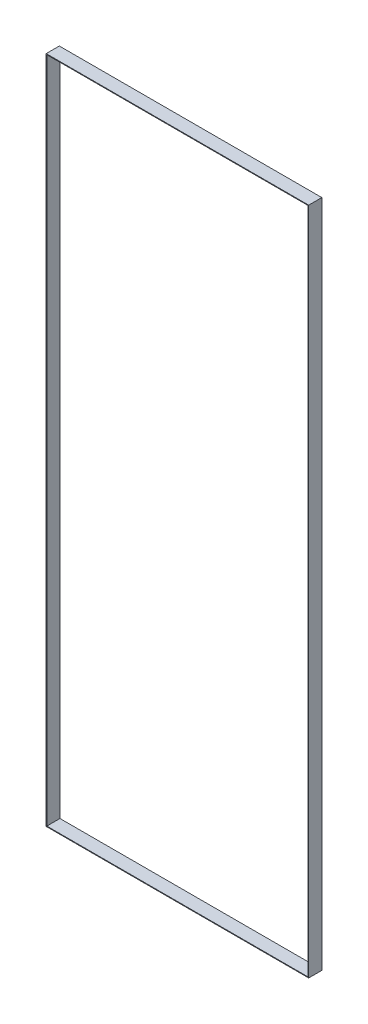
ISO-10303-21;
HEADER;
FILE_DESCRIPTION(('STEP AP214'),'2;1');
FILE_NAME('part.step','',(''),(''),'','','');
FILE_SCHEMA(('AUTOMOTIVE_DESIGN { 1 0 10303 214 1 1 1 1 }'));
ENDSEC;
DATA;
#1=APPLICATION_CONTEXT('core data for automotive mechanical design processes');
#2=APPLICATION_PROTOCOL_DEFINITION('international standard','automotive_design',2000,#1);
#3=PRODUCT_CONTEXT('',#1,'mechanical');
#4=PRODUCT('Part','Part','',(#3));
#5=PRODUCT_RELATED_PRODUCT_CATEGORY('part','',(#4));
#6=PRODUCT_DEFINITION_FORMATION('','',#4);
#7=PRODUCT_DEFINITION_CONTEXT('part definition',#1,'design');
#8=PRODUCT_DEFINITION('design','',#6,#7);
#9=PRODUCT_DEFINITION_SHAPE('','',#8);
#10=(LENGTH_UNIT() NAMED_UNIT(*) SI_UNIT(.MILLI.,.METRE.));
#11=(NAMED_UNIT(*) PLANE_ANGLE_UNIT() SI_UNIT($,.RADIAN.));
#12=(NAMED_UNIT(*) SI_UNIT($,.STERADIAN.) SOLID_ANGLE_UNIT());
#13=UNCERTAINTY_MEASURE_WITH_UNIT(LENGTH_MEASURE(1.E-05),#10,'distance_accuracy_value','');
#14=(GEOMETRIC_REPRESENTATION_CONTEXT(3) GLOBAL_UNCERTAINTY_ASSIGNED_CONTEXT((#13)) GLOBAL_UNIT_ASSIGNED_CONTEXT((#10,
#11,#12)) REPRESENTATION_CONTEXT('',''));
#15=CARTESIAN_POINT('',(0.,0.,0.));
#16=DIRECTION('',(0.,0.,1.));
#17=DIRECTION('',(1.,0.,0.));
#18=AXIS2_PLACEMENT_3D('',#15,#16,#17);
#19=CARTESIAN_POINT('',(-200.,-510.,20.));
#20=DIRECTION('',(1.,0.,0.));
#21=DIRECTION('',(0.,0.,-1.));
#22=AXIS2_PLACEMENT_3D('',#19,#20,#21);
#23=PLANE('',#22);
#24=DIRECTION('',(0.,-1.,0.));
#25=VECTOR('',#24,1.);
#26=CARTESIAN_POINT('',(-200.,-510.,0.));
#27=LINE('',#26,#25);
#28=CARTESIAN_POINT('',(-200.,510.,0.));
#29=VERTEX_POINT('',#28);
#30=CARTESIAN_POINT('',(-200.,-510.,0.));
#31=VERTEX_POINT('',#30);
#32=EDGE_CURVE('E130',#29,#31,#27,.T.);
#33=ORIENTED_EDGE('',*,*,#32,.T.);
#34=DIRECTION('',(0.,0.,-1.));
#35=VECTOR('',#34,1.);
#36=CARTESIAN_POINT('',(-200.,-510.,20.));
#37=LINE('',#36,#35);
#38=CARTESIAN_POINT('',(-200.,-510.,20.));
#39=VERTEX_POINT('',#38);
#40=EDGE_CURVE('E11',#39,#31,#37,.T.);
#41=ORIENTED_EDGE('',*,*,#40,.F.);
#42=DIRECTION('',(0.,-1.,0.));
#43=VECTOR('',#42,1.);
#44=CARTESIAN_POINT('',(-200.,-510.,20.));
#45=LINE('',#44,#43);
#46=CARTESIAN_POINT('',(-200.,510.,20.));
#47=VERTEX_POINT('',#46);
#48=EDGE_CURVE('E134',#47,#39,#45,.T.);
#49=ORIENTED_EDGE('',*,*,#48,.F.);
#50=DIRECTION('',(0.,0.,-1.));
#51=VECTOR('',#50,1.);
#52=CARTESIAN_POINT('',(-200.,510.,20.));
#53=LINE('',#52,#51);
#54=EDGE_CURVE('E144',#47,#29,#53,.T.);
#55=ORIENTED_EDGE('',*,*,#54,.T.);
#56=EDGE_LOOP('',(#33,#41,#49,#55));
#57=FACE_BOUND('',#56,.T.);
#58=ADVANCED_FACE('F33',(#57),#23,.F.);
#59=CARTESIAN_POINT('',(200.,-510.,20.));
#60=DIRECTION('',(0.,1.,0.));
#61=DIRECTION('',(-1.,0.,0.));
#62=AXIS2_PLACEMENT_3D('',#59,#60,#61);
#63=PLANE('',#62);
#64=DIRECTION('',(1.,0.,0.));
#65=VECTOR('',#64,1.);
#66=CARTESIAN_POINT('',(200.,-510.,0.));
#67=LINE('',#66,#65);
#68=CARTESIAN_POINT('',(200.,-510.,0.));
#69=VERTEX_POINT('',#68);
#70=EDGE_CURVE('E147',#31,#69,#67,.T.);
#71=ORIENTED_EDGE('',*,*,#70,.T.);
#72=DIRECTION('',(0.,0.,-1.));
#73=VECTOR('',#72,1.);
#74=CARTESIAN_POINT('',(200.,-510.,20.));
#75=LINE('',#74,#73);
#76=CARTESIAN_POINT('',(200.,-510.,20.));
#77=VERTEX_POINT('',#76);
#78=EDGE_CURVE('E40',#77,#69,#75,.T.);
#79=ORIENTED_EDGE('',*,*,#78,.F.);
#80=DIRECTION('',(1.,0.,0.));
#81=VECTOR('',#80,1.);
#82=CARTESIAN_POINT('',(200.,-510.,20.));
#83=LINE('',#82,#81);
#84=EDGE_CURVE('E137',#39,#77,#83,.T.);
#85=ORIENTED_EDGE('',*,*,#84,.F.);
#86=ORIENTED_EDGE('',*,*,#40,.T.);
#87=EDGE_LOOP('',(#71,#79,#85,#86));
#88=FACE_BOUND('',#87,.T.);
#89=ADVANCED_FACE('F175',(#88),#63,.F.);
#90=CARTESIAN_POINT('',(200.,-510.,20.));
#91=DIRECTION('',(-1.,0.,0.));
#92=DIRECTION('',(0.,0.,1.));
#93=AXIS2_PLACEMENT_3D('',#90,#91,#92);
#94=PLANE('',#93);
#95=DIRECTION('',(0.,1.,0.));
#96=VECTOR('',#95,1.);
#97=CARTESIAN_POINT('',(200.,-510.,0.));
#98=LINE('',#97,#96);
#99=CARTESIAN_POINT('',(200.,510.,0.));
#100=VERTEX_POINT('',#99);
#101=EDGE_CURVE('E149',#69,#100,#98,.T.);
#102=ORIENTED_EDGE('',*,*,#101,.T.);
#103=DIRECTION('',(0.,0.,-1.));
#104=VECTOR('',#103,1.);
#105=CARTESIAN_POINT('',(200.,510.,20.));
#106=LINE('',#105,#104);
#107=CARTESIAN_POINT('',(200.,510.,20.));
#108=VERTEX_POINT('',#107);
#109=EDGE_CURVE('E154',#108,#100,#106,.T.);
#110=ORIENTED_EDGE('',*,*,#109,.F.);
#111=DIRECTION('',(0.,1.,0.));
#112=VECTOR('',#111,1.);
#113=CARTESIAN_POINT('',(200.,-510.,20.));
#114=LINE('',#113,#112);
#115=EDGE_CURVE('E140',#77,#108,#114,.T.);
#116=ORIENTED_EDGE('',*,*,#115,.F.);
#117=ORIENTED_EDGE('',*,*,#78,.T.);
#118=EDGE_LOOP('',(#102,#110,#116,#117));
#119=FACE_BOUND('',#118,.T.);
#120=ADVANCED_FACE('F161',(#119),#94,.F.);
#121=CARTESIAN_POINT('',(200.,510.,20.));
#122=DIRECTION('',(0.,-1.,0.));
#123=DIRECTION('',(0.,0.,-1.));
#124=AXIS2_PLACEMENT_3D('',#121,#122,#123);
#125=PLANE('',#124);
#126=DIRECTION('',(-1.,0.,0.));
#127=VECTOR('',#126,1.);
#128=CARTESIAN_POINT('',(200.,510.,0.));
#129=LINE('',#128,#127);
#130=EDGE_CURVE('E138',#100,#29,#129,.T.);
#131=ORIENTED_EDGE('',*,*,#130,.T.);
#132=ORIENTED_EDGE('',*,*,#54,.F.);
#133=DIRECTION('',(-1.,0.,0.));
#134=VECTOR('',#133,1.);
#135=CARTESIAN_POINT('',(200.,510.,20.));
#136=LINE('',#135,#134);
#137=EDGE_CURVE('E142',#108,#47,#136,.T.);
#138=ORIENTED_EDGE('',*,*,#137,.F.);
#139=ORIENTED_EDGE('',*,*,#109,.T.);
#140=EDGE_LOOP('',(#131,#132,#138,#139));
#141=FACE_BOUND('',#140,.T.);
#142=ADVANCED_FACE('F168',(#141),#125,.F.);
#143=CARTESIAN_POINT('',(0.,0.,20.));
#144=DIRECTION('',(0.,0.,1.));
#145=DIRECTION('',(1.,0.,0.));
#146=AXIS2_PLACEMENT_3D('',#143,#144,#145);
#147=PLANE('',#146);
#148=DIRECTION('',(0.,-1.,0.));
#149=VECTOR('',#148,1.);
#150=CARTESIAN_POINT('',(-199.,-509.,20.));
#151=LINE('',#150,#149);
#152=CARTESIAN_POINT('',(-199.,509.,20.));
#153=VERTEX_POINT('',#152);
#154=CARTESIAN_POINT('',(-199.,-509.,20.));
#155=VERTEX_POINT('',#154);
#156=EDGE_CURVE('E47',#153,#155,#151,.T.);
#157=ORIENTED_EDGE('',*,*,#156,.F.);
#158=DIRECTION('',(-1.,0.,0.));
#159=VECTOR('',#158,1.);
#160=CARTESIAN_POINT('',(199.,509.,20.));
#161=LINE('',#160,#159);
#162=CARTESIAN_POINT('',(199.,509.,20.));
#163=VERTEX_POINT('',#162);
#164=EDGE_CURVE('E115',#163,#153,#161,.T.);
#165=ORIENTED_EDGE('',*,*,#164,.F.);
#166=DIRECTION('',(0.,1.,0.));
#167=VECTOR('',#166,1.);
#168=CARTESIAN_POINT('',(199.,-509.,20.));
#169=LINE('',#168,#167);
#170=CARTESIAN_POINT('',(199.,-509.,20.));
#171=VERTEX_POINT('',#170);
#172=EDGE_CURVE('E118',#171,#163,#169,.T.);
#173=ORIENTED_EDGE('',*,*,#172,.F.);
#174=DIRECTION('',(1.,0.,0.));
#175=VECTOR('',#174,1.);
#176=CARTESIAN_POINT('',(199.,-509.,20.));
#177=LINE('',#176,#175);
#178=EDGE_CURVE('E124',#155,#171,#177,.T.);
#179=ORIENTED_EDGE('',*,*,#178,.F.);
#180=EDGE_LOOP('',(#157,#165,#173,#179));
#181=FACE_BOUND('',#180,.T.);
#182=ORIENTED_EDGE('',*,*,#48,.T.);
#183=ORIENTED_EDGE('',*,*,#84,.T.);
#184=ORIENTED_EDGE('',*,*,#115,.T.);
#185=ORIENTED_EDGE('',*,*,#137,.T.);
#186=EDGE_LOOP('',(#182,#183,#184,#185));
#187=FACE_BOUND('',#186,.T.);
#188=ADVANCED_FACE('F174',(#181,#187),#147,.T.);
#189=CARTESIAN_POINT('',(0.,0.,0.));
#190=DIRECTION('',(0.,0.,1.));
#191=DIRECTION('',(1.,0.,0.));
#192=AXIS2_PLACEMENT_3D('',#189,#190,#191);
#193=PLANE('',#192);
#194=DIRECTION('',(-1.,0.,0.));
#195=VECTOR('',#194,1.);
#196=CARTESIAN_POINT('',(199.,509.,0.));
#197=LINE('',#196,#195);
#198=CARTESIAN_POINT('',(199.,509.,0.));
#199=VERTEX_POINT('',#198);
#200=CARTESIAN_POINT('',(-199.,509.,0.));
#201=VERTEX_POINT('',#200);
#202=EDGE_CURVE('E105',#199,#201,#197,.T.);
#203=ORIENTED_EDGE('',*,*,#202,.T.);
#204=DIRECTION('',(0.,-1.,0.));
#205=VECTOR('',#204,1.);
#206=CARTESIAN_POINT('',(-199.,-509.,0.));
#207=LINE('',#206,#205);
#208=CARTESIAN_POINT('',(-199.,-509.,0.));
#209=VERTEX_POINT('',#208);
#210=EDGE_CURVE('E99',#201,#209,#207,.T.);
#211=ORIENTED_EDGE('',*,*,#210,.T.);
#212=DIRECTION('',(1.,0.,0.));
#213=VECTOR('',#212,1.);
#214=CARTESIAN_POINT('',(199.,-509.,0.));
#215=LINE('',#214,#213);
#216=CARTESIAN_POINT('',(199.,-509.,0.));
#217=VERTEX_POINT('',#216);
#218=EDGE_CURVE('E108',#209,#217,#215,.T.);
#219=ORIENTED_EDGE('',*,*,#218,.T.);
#220=DIRECTION('',(0.,1.,0.));
#221=VECTOR('',#220,1.);
#222=CARTESIAN_POINT('',(199.,-509.,0.));
#223=LINE('',#222,#221);
#224=EDGE_CURVE('E55',#217,#199,#223,.T.);
#225=ORIENTED_EDGE('',*,*,#224,.T.);
#226=EDGE_LOOP('',(#203,#211,#219,#225));
#227=FACE_BOUND('',#226,.T.);
#228=ORIENTED_EDGE('',*,*,#32,.F.);
#229=ORIENTED_EDGE('',*,*,#130,.F.);
#230=ORIENTED_EDGE('',*,*,#101,.F.);
#231=ORIENTED_EDGE('',*,*,#70,.F.);
#232=EDGE_LOOP('',(#228,#229,#230,#231));
#233=FACE_BOUND('',#232,.T.);
#234=ADVANCED_FACE('F112',(#227,#233),#193,.F.);
#235=CARTESIAN_POINT('',(-199.,-509.,0.));
#236=DIRECTION('',(-1.,0.,0.));
#237=DIRECTION('',(0.,0.,1.));
#238=AXIS2_PLACEMENT_3D('',#235,#236,#237);
#239=PLANE('',#238);
#240=ORIENTED_EDGE('',*,*,#156,.T.);
#241=DIRECTION('',(0.,0.,1.));
#242=VECTOR('',#241,1.);
#243=CARTESIAN_POINT('',(-199.,-509.,0.));
#244=LINE('',#243,#242);
#245=EDGE_CURVE('E95',#209,#155,#244,.T.);
#246=ORIENTED_EDGE('',*,*,#245,.F.);
#247=ORIENTED_EDGE('',*,*,#210,.F.);
#248=DIRECTION('',(0.,0.,1.));
#249=VECTOR('',#248,1.);
#250=CARTESIAN_POINT('',(-199.,509.,0.));
#251=LINE('',#250,#249);
#252=EDGE_CURVE('E128',#201,#153,#251,.T.);
#253=ORIENTED_EDGE('',*,*,#252,.T.);
#254=EDGE_LOOP('',(#240,#246,#247,#253));
#255=FACE_BOUND('',#254,.T.);
#256=ADVANCED_FACE('F97',(#255),#239,.F.);
#257=CARTESIAN_POINT('',(199.,509.,0.));
#258=DIRECTION('',(0.,1.,0.));
#259=DIRECTION('',(0.,0.,1.));
#260=AXIS2_PLACEMENT_3D('',#257,#258,#259);
#261=PLANE('',#260);
#262=ORIENTED_EDGE('',*,*,#164,.T.);
#263=ORIENTED_EDGE('',*,*,#252,.F.);
#264=ORIENTED_EDGE('',*,*,#202,.F.);
#265=DIRECTION('',(0.,0.,1.));
#266=VECTOR('',#265,1.);
#267=CARTESIAN_POINT('',(199.,509.,0.));
#268=LINE('',#267,#266);
#269=EDGE_CURVE('E131',#199,#163,#268,.T.);
#270=ORIENTED_EDGE('',*,*,#269,.T.);
#271=EDGE_LOOP('',(#262,#263,#264,#270));
#272=FACE_BOUND('',#271,.T.);
#273=ADVANCED_FACE('F192',(#272),#261,.F.);
#274=CARTESIAN_POINT('',(199.,-509.,0.));
#275=DIRECTION('',(1.,0.,0.));
#276=DIRECTION('',(0.,0.,-1.));
#277=AXIS2_PLACEMENT_3D('',#274,#275,#276);
#278=PLANE('',#277);
#279=ORIENTED_EDGE('',*,*,#172,.T.);
#280=ORIENTED_EDGE('',*,*,#269,.F.);
#281=ORIENTED_EDGE('',*,*,#224,.F.);
#282=DIRECTION('',(0.,0.,1.));
#283=VECTOR('',#282,1.);
#284=CARTESIAN_POINT('',(199.,-509.,0.));
#285=LINE('',#284,#283);
#286=EDGE_CURVE('E104',#217,#171,#285,.T.);
#287=ORIENTED_EDGE('',*,*,#286,.T.);
#288=EDGE_LOOP('',(#279,#280,#281,#287));
#289=FACE_BOUND('',#288,.T.);
#290=ADVANCED_FACE('F195',(#289),#278,.F.);
#291=CARTESIAN_POINT('',(199.,-509.,0.));
#292=DIRECTION('',(0.,-1.,0.));
#293=DIRECTION('',(0.,0.,-1.));
#294=AXIS2_PLACEMENT_3D('',#291,#292,#293);
#295=PLANE('',#294);
#296=ORIENTED_EDGE('',*,*,#178,.T.);
#297=ORIENTED_EDGE('',*,*,#286,.F.);
#298=ORIENTED_EDGE('',*,*,#218,.F.);
#299=ORIENTED_EDGE('',*,*,#245,.T.);
#300=EDGE_LOOP('',(#296,#297,#298,#299));
#301=FACE_BOUND('',#300,.T.);
#302=ADVANCED_FACE('F109',(#301),#295,.F.);
#303=CLOSED_SHELL('',(#58,#89,#120,#142,#188,#234,#256,#273,#290,#302));
#304=MANIFOLD_SOLID_BREP('B2',#303);
#305=ADVANCED_BREP_SHAPE_REPRESENTATION('',(#18,#304),#14);
#306=SHAPE_DEFINITION_REPRESENTATION(#9,#305);
ENDSEC;
END-ISO-10303-21;
